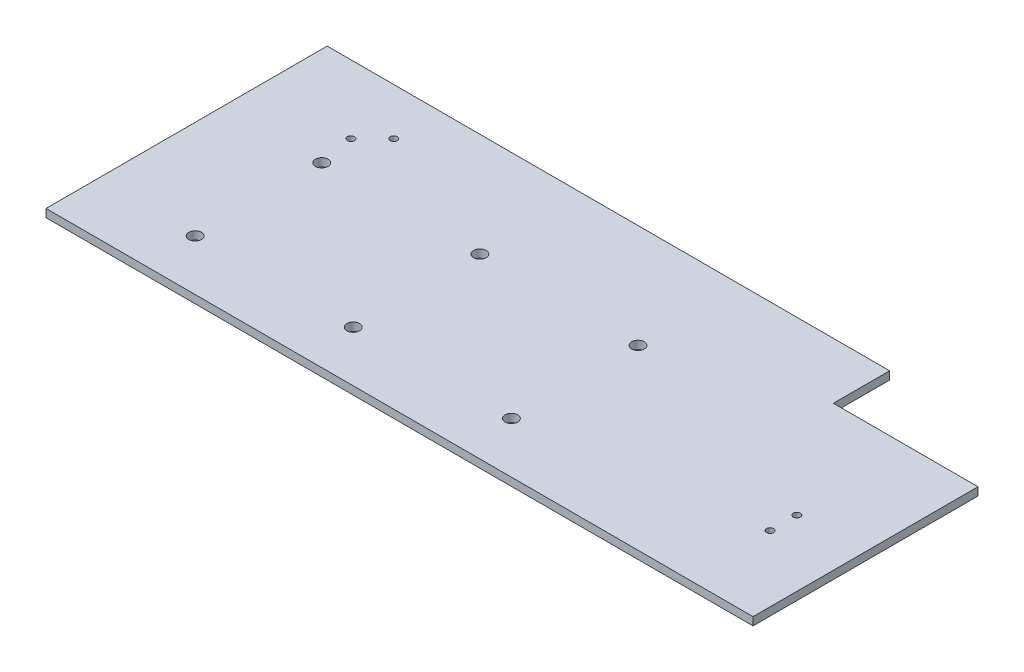
ISO-10303-21;
HEADER;
FILE_DESCRIPTION(('STEP AP214'),'2;1');
FILE_NAME('part.step','',(''),(''),'','','');
FILE_SCHEMA(('AUTOMOTIVE_DESIGN { 1 0 10303 214 1 1 1 1 }'));
ENDSEC;
DATA;
#1=APPLICATION_CONTEXT('core data for automotive mechanical design processes');
#2=APPLICATION_PROTOCOL_DEFINITION('international standard','automotive_design',2000,#1);
#3=PRODUCT_CONTEXT('',#1,'mechanical');
#4=PRODUCT('Part','Part','',(#3));
#5=PRODUCT_RELATED_PRODUCT_CATEGORY('part','',(#4));
#6=PRODUCT_DEFINITION_FORMATION('','',#4);
#7=PRODUCT_DEFINITION_CONTEXT('part definition',#1,'design');
#8=PRODUCT_DEFINITION('design','',#6,#7);
#9=PRODUCT_DEFINITION_SHAPE('','',#8);
#10=(LENGTH_UNIT() NAMED_UNIT(*) SI_UNIT(.MILLI.,.METRE.));
#11=(NAMED_UNIT(*) PLANE_ANGLE_UNIT() SI_UNIT($,.RADIAN.));
#12=(NAMED_UNIT(*) SI_UNIT($,.STERADIAN.) SOLID_ANGLE_UNIT());
#13=UNCERTAINTY_MEASURE_WITH_UNIT(LENGTH_MEASURE(1.E-05),#10,'distance_accuracy_value','');
#14=(GEOMETRIC_REPRESENTATION_CONTEXT(3) GLOBAL_UNCERTAINTY_ASSIGNED_CONTEXT((#13)) GLOBAL_UNIT_ASSIGNED_CONTEXT((#10,
#11,#12)) REPRESENTATION_CONTEXT('',''));
#15=CARTESIAN_POINT('',(0.,0.,0.));
#16=DIRECTION('',(0.,0.,1.));
#17=DIRECTION('',(1.,0.,0.));
#18=AXIS2_PLACEMENT_3D('',#15,#16,#17);
#19=CARTESIAN_POINT('',(-558.8,6.35,0.));
#20=DIRECTION('',(0.,0.,-1.));
#21=DIRECTION('',(-1.,0.,0.));
#22=AXIS2_PLACEMENT_3D('',#19,#20,#21);
#23=PLANE('',#22);
#24=DIRECTION('',(1.,0.,0.));
#25=VECTOR('',#24,1.);
#26=CARTESIAN_POINT('',(-558.8,0.,0.));
#27=LINE('',#26,#25);
#28=CARTESIAN_POINT('',(-558.8,0.,0.));
#29=VERTEX_POINT('',#28);
#30=CARTESIAN_POINT('',(0.,0.,0.));
#31=VERTEX_POINT('',#30);
#32=EDGE_CURVE('E122',#29,#31,#27,.T.);
#33=ORIENTED_EDGE('',*,*,#32,.T.);
#34=DIRECTION('',(0.,-1.,0.));
#35=VECTOR('',#34,1.);
#36=CARTESIAN_POINT('',(0.,6.35,0.));
#37=LINE('',#36,#35);
#38=CARTESIAN_POINT('',(0.,6.35,0.));
#39=VERTEX_POINT('',#38);
#40=EDGE_CURVE('E11',#39,#31,#37,.T.);
#41=ORIENTED_EDGE('',*,*,#40,.F.);
#42=DIRECTION('',(1.,0.,0.));
#43=VECTOR('',#42,1.);
#44=CARTESIAN_POINT('',(-558.8,6.35,0.));
#45=LINE('',#44,#43);
#46=CARTESIAN_POINT('',(-558.8,6.35,0.));
#47=VERTEX_POINT('',#46);
#48=EDGE_CURVE('E133',#47,#39,#45,.T.);
#49=ORIENTED_EDGE('',*,*,#48,.F.);
#50=DIRECTION('',(0.,-1.,0.));
#51=VECTOR('',#50,1.);
#52=CARTESIAN_POINT('',(-558.8,6.35,0.));
#53=LINE('',#52,#51);
#54=EDGE_CURVE('E118',#47,#29,#53,.T.);
#55=ORIENTED_EDGE('',*,*,#54,.T.);
#56=EDGE_LOOP('',(#33,#41,#49,#55));
#57=FACE_BOUND('',#56,.T.);
#58=ADVANCED_FACE('F38',(#57),#23,.F.);
#59=CARTESIAN_POINT('',(0.,6.35,0.));
#60=DIRECTION('',(-1.,0.,0.));
#61=DIRECTION('',(0.,0.,1.));
#62=AXIS2_PLACEMENT_3D('',#59,#60,#61);
#63=PLANE('',#62);
#64=DIRECTION('',(0.,0.,-1.));
#65=VECTOR('',#64,1.);
#66=CARTESIAN_POINT('',(0.,0.,0.));
#67=LINE('',#66,#65);
#68=CARTESIAN_POINT('',(0.,0.,-177.8));
#69=VERTEX_POINT('',#68);
#70=EDGE_CURVE('E125',#31,#69,#67,.T.);
#71=ORIENTED_EDGE('',*,*,#70,.T.);
#72=DIRECTION('',(0.,-1.,0.));
#73=VECTOR('',#72,1.);
#74=CARTESIAN_POINT('',(0.,6.35,-177.8));
#75=LINE('',#74,#73);
#76=CARTESIAN_POINT('',(0.,6.35,-177.8));
#77=VERTEX_POINT('',#76);
#78=EDGE_CURVE('E46',#77,#69,#75,.T.);
#79=ORIENTED_EDGE('',*,*,#78,.F.);
#80=DIRECTION('',(0.,0.,-1.));
#81=VECTOR('',#80,1.);
#82=CARTESIAN_POINT('',(0.,6.35,0.));
#83=LINE('',#82,#81);
#84=EDGE_CURVE('E91',#39,#77,#83,.T.);
#85=ORIENTED_EDGE('',*,*,#84,.F.);
#86=ORIENTED_EDGE('',*,*,#40,.T.);
#87=EDGE_LOOP('',(#71,#79,#85,#86));
#88=FACE_BOUND('',#87,.T.);
#89=ADVANCED_FACE('F158',(#88),#63,.F.);
#90=CARTESIAN_POINT('',(0.,6.35,-177.8));
#91=DIRECTION('',(0.,0.,1.));
#92=DIRECTION('',(1.,0.,0.));
#93=AXIS2_PLACEMENT_3D('',#90,#91,#92);
#94=PLANE('',#93);
#95=DIRECTION('',(-1.,0.,0.));
#96=VECTOR('',#95,1.);
#97=CARTESIAN_POINT('',(0.,0.,-177.8));
#98=LINE('',#97,#96);
#99=CARTESIAN_POINT('',(-114.3,0.,-177.8));
#100=VERTEX_POINT('',#99);
#101=EDGE_CURVE('E128',#69,#100,#98,.T.);
#102=ORIENTED_EDGE('',*,*,#101,.T.);
#103=DIRECTION('',(0.,-1.,0.));
#104=VECTOR('',#103,1.);
#105=CARTESIAN_POINT('',(-114.3,6.35,-177.8));
#106=LINE('',#105,#104);
#107=CARTESIAN_POINT('',(-114.3,6.35,-177.8));
#108=VERTEX_POINT('',#107);
#109=EDGE_CURVE('E113',#108,#100,#106,.T.);
#110=ORIENTED_EDGE('',*,*,#109,.F.);
#111=DIRECTION('',(-1.,0.,0.));
#112=VECTOR('',#111,1.);
#113=CARTESIAN_POINT('',(0.,6.35,-177.8));
#114=LINE('',#113,#112);
#115=EDGE_CURVE('E104',#77,#108,#114,.T.);
#116=ORIENTED_EDGE('',*,*,#115,.F.);
#117=ORIENTED_EDGE('',*,*,#78,.T.);
#118=EDGE_LOOP('',(#102,#110,#116,#117));
#119=FACE_BOUND('',#118,.T.);
#120=ADVANCED_FACE('F139',(#119),#94,.F.);
#121=CARTESIAN_POINT('',(-114.3,6.35,-177.8));
#122=DIRECTION('',(-1.,0.,0.));
#123=DIRECTION('',(0.,0.,1.));
#124=AXIS2_PLACEMENT_3D('',#121,#122,#123);
#125=PLANE('',#124);
#126=DIRECTION('',(0.,0.,-1.));
#127=VECTOR('',#126,1.);
#128=CARTESIAN_POINT('',(-114.3,0.,-177.8));
#129=LINE('',#128,#127);
#130=CARTESIAN_POINT('',(-114.3,0.,-222.25));
#131=VERTEX_POINT('',#130);
#132=EDGE_CURVE('E112',#100,#131,#129,.T.);
#133=ORIENTED_EDGE('',*,*,#132,.T.);
#134=DIRECTION('',(0.,-1.,0.));
#135=VECTOR('',#134,1.);
#136=CARTESIAN_POINT('',(-114.3,6.35,-222.25));
#137=LINE('',#136,#135);
#138=CARTESIAN_POINT('',(-114.3,6.35,-222.25));
#139=VERTEX_POINT('',#138);
#140=EDGE_CURVE('E109',#139,#131,#137,.T.);
#141=ORIENTED_EDGE('',*,*,#140,.F.);
#142=DIRECTION('',(0.,0.,-1.));
#143=VECTOR('',#142,1.);
#144=CARTESIAN_POINT('',(-114.3,6.35,-177.8));
#145=LINE('',#144,#143);
#146=EDGE_CURVE('E98',#108,#139,#145,.T.);
#147=ORIENTED_EDGE('',*,*,#146,.F.);
#148=ORIENTED_EDGE('',*,*,#109,.T.);
#149=EDGE_LOOP('',(#133,#141,#147,#148));
#150=FACE_BOUND('',#149,.T.);
#151=ADVANCED_FACE('F110',(#150),#125,.F.);
#152=CARTESIAN_POINT('',(-114.3,6.35,-222.25));
#153=DIRECTION('',(0.,0.,1.));
#154=DIRECTION('',(1.,0.,0.));
#155=AXIS2_PLACEMENT_3D('',#152,#153,#154);
#156=PLANE('',#155);
#157=DIRECTION('',(-1.,0.,0.));
#158=VECTOR('',#157,1.);
#159=CARTESIAN_POINT('',(-114.3,0.,-222.25));
#160=LINE('',#159,#158);
#161=CARTESIAN_POINT('',(-558.8,0.,-222.25));
#162=VERTEX_POINT('',#161);
#163=EDGE_CURVE('E77',#131,#162,#160,.T.);
#164=ORIENTED_EDGE('',*,*,#163,.T.);
#165=DIRECTION('',(0.,-1.,0.));
#166=VECTOR('',#165,1.);
#167=CARTESIAN_POINT('',(-558.8,6.35,-222.25));
#168=LINE('',#167,#166);
#169=CARTESIAN_POINT('',(-558.8,6.35,-222.25));
#170=VERTEX_POINT('',#169);
#171=EDGE_CURVE('E114',#170,#162,#168,.T.);
#172=ORIENTED_EDGE('',*,*,#171,.F.);
#173=DIRECTION('',(-1.,0.,0.));
#174=VECTOR('',#173,1.);
#175=CARTESIAN_POINT('',(-114.3,6.35,-222.25));
#176=LINE('',#175,#174);
#177=EDGE_CURVE('E102',#139,#170,#176,.T.);
#178=ORIENTED_EDGE('',*,*,#177,.F.);
#179=ORIENTED_EDGE('',*,*,#140,.T.);
#180=EDGE_LOOP('',(#164,#172,#178,#179));
#181=FACE_BOUND('',#180,.T.);
#182=ADVANCED_FACE('F116',(#181),#156,.F.);
#183=CARTESIAN_POINT('',(-558.8,6.35,-222.25));
#184=DIRECTION('',(1.,0.,0.));
#185=DIRECTION('',(0.,0.,-1.));
#186=AXIS2_PLACEMENT_3D('',#183,#184,#185);
#187=PLANE('',#186);
#188=DIRECTION('',(0.,0.,1.));
#189=VECTOR('',#188,1.);
#190=CARTESIAN_POINT('',(-558.8,0.,-222.25));
#191=LINE('',#190,#189);
#192=EDGE_CURVE('E83',#162,#29,#191,.T.);
#193=ORIENTED_EDGE('',*,*,#192,.T.);
#194=ORIENTED_EDGE('',*,*,#54,.F.);
#195=DIRECTION('',(0.,0.,1.));
#196=VECTOR('',#195,1.);
#197=CARTESIAN_POINT('',(-558.8,6.35,-222.25));
#198=LINE('',#197,#196);
#199=EDGE_CURVE('E54',#170,#47,#198,.T.);
#200=ORIENTED_EDGE('',*,*,#199,.F.);
#201=ORIENTED_EDGE('',*,*,#171,.T.);
#202=EDGE_LOOP('',(#193,#194,#200,#201));
#203=FACE_BOUND('',#202,.T.);
#204=ADVANCED_FACE('F146',(#203),#187,.F.);
#205=CARTESIAN_POINT('',(0.,6.35,0.));
#206=DIRECTION('',(0.,1.,0.));
#207=DIRECTION('',(0.,0.,1.));
#208=AXIS2_PLACEMENT_3D('',#205,#206,#207);
#209=PLANE('',#208);
#210=CARTESIAN_POINT('',(-486.075566666667,6.35,-168.253833333333));
#211=DIRECTION('',(0.,-1.,0.));
#212=DIRECTION('',(0.,0.,-1.));
#213=AXIS2_PLACEMENT_3D('',#210,#211,#212);
#214=CIRCLE('',#213,2.77812500000002);
#215=CARTESIAN_POINT('',(-486.075566666667,6.35,-171.031958333333));
#216=VERTEX_POINT('',#215);
#217=EDGE_CURVE('E301',#216,#216,#214,.T.);
#218=ORIENTED_EDGE('',*,*,#217,.T.);
#219=EDGE_LOOP('',(#218));
#220=FACE_BOUND('',#219,.T.);
#221=CARTESIAN_POINT('',(-469.142233333333,6.35,-185.187166666667));
#222=DIRECTION('',(0.,-1.,0.));
#223=DIRECTION('',(0.,0.,-1.));
#224=AXIS2_PLACEMENT_3D('',#221,#222,#223);
#225=CIRCLE('',#224,2.77812500000002);
#226=CARTESIAN_POINT('',(-469.142233333333,6.35,-187.965291666667));
#227=VERTEX_POINT('',#226);
#228=EDGE_CURVE('E391',#227,#227,#225,.T.);
#229=ORIENTED_EDGE('',*,*,#228,.T.);
#230=EDGE_LOOP('',(#229));
#231=FACE_BOUND('',#230,.T.);
#232=CARTESIAN_POINT('',(-52.1589,6.35,-65.6166666666667));
#233=DIRECTION('',(0.,-1.,0.));
#234=DIRECTION('',(0.,0.,-1.));
#235=AXIS2_PLACEMENT_3D('',#232,#233,#234);
#236=CIRCLE('',#235,2.778125);
#237=CARTESIAN_POINT('',(-52.1589,6.35,-68.3947916666667));
#238=VERTEX_POINT('',#237);
#239=EDGE_CURVE('E317',#238,#238,#236,.T.);
#240=ORIENTED_EDGE('',*,*,#239,.T.);
#241=EDGE_LOOP('',(#240));
#242=FACE_BOUND('',#241,.T.);
#243=CARTESIAN_POINT('',(-52.1589,6.35,-86.7833333333333));
#244=DIRECTION('',(0.,-1.,0.));
#245=DIRECTION('',(0.,0.,-1.));
#246=AXIS2_PLACEMENT_3D('',#243,#244,#245);
#247=CIRCLE('',#246,2.778125);
#248=CARTESIAN_POINT('',(-52.1589,6.35,-89.5614583333334));
#249=VERTEX_POINT('',#248);
#250=EDGE_CURVE('E310',#249,#249,#247,.T.);
#251=ORIENTED_EDGE('',*,*,#250,.T.);
#252=EDGE_LOOP('',(#251));
#253=FACE_BOUND('',#252,.T.);
#254=CARTESIAN_POINT('',(-481.076,6.35,-140.208));
#255=DIRECTION('',(0.,1.,0.));
#256=DIRECTION('',(0.,0.,1.));
#257=AXIS2_PLACEMENT_3D('',#254,#255,#256);
#258=CIRCLE('',#257,5.00000270000002);
#259=CARTESIAN_POINT('',(-481.076,6.35,-135.2079973));
#260=VERTEX_POINT('',#259);
#261=EDGE_CURVE('E126',#260,#260,#258,.T.);
#262=ORIENTED_EDGE('',*,*,#261,.F.);
#263=EDGE_LOOP('',(#262));
#264=FACE_BOUND('',#263,.T.);
#265=CARTESIAN_POINT('',(-231.14,6.35,-140.208));
#266=DIRECTION('',(0.,1.,0.));
#267=DIRECTION('',(0.,0.,1.));
#268=AXIS2_PLACEMENT_3D('',#265,#266,#267);
#269=CIRCLE('',#268,5.00000270000002);
#270=CARTESIAN_POINT('',(-231.14,6.35,-135.2079973));
#271=VERTEX_POINT('',#270);
#272=EDGE_CURVE('E347',#271,#271,#269,.T.);
#273=ORIENTED_EDGE('',*,*,#272,.F.);
#274=EDGE_LOOP('',(#273));
#275=FACE_BOUND('',#274,.T.);
#276=CARTESIAN_POINT('',(-356.108,6.35,-140.208));
#277=DIRECTION('',(0.,1.,0.));
#278=DIRECTION('',(0.,0.,1.));
#279=AXIS2_PLACEMENT_3D('',#276,#277,#278);
#280=CIRCLE('',#279,5.00000270000002);
#281=CARTESIAN_POINT('',(-356.108,6.35,-135.2079973));
#282=VERTEX_POINT('',#281);
#283=EDGE_CURVE('E344',#282,#282,#280,.T.);
#284=ORIENTED_EDGE('',*,*,#283,.F.);
#285=EDGE_LOOP('',(#284));
#286=FACE_BOUND('',#285,.T.);
#287=CARTESIAN_POINT('',(-231.14,6.35,-40.132));
#288=DIRECTION('',(0.,1.,0.));
#289=DIRECTION('',(0.,0.,1.));
#290=AXIS2_PLACEMENT_3D('',#287,#288,#289);
#291=CIRCLE('',#290,5.00000270000002);
#292=CARTESIAN_POINT('',(-231.14,6.35,-35.1319973));
#293=VERTEX_POINT('',#292);
#294=EDGE_CURVE('E341',#293,#293,#291,.T.);
#295=ORIENTED_EDGE('',*,*,#294,.F.);
#296=EDGE_LOOP('',(#295));
#297=FACE_BOUND('',#296,.T.);
#298=CARTESIAN_POINT('',(-356.108,6.35,-40.132));
#299=DIRECTION('',(0.,1.,0.));
#300=DIRECTION('',(0.,0.,1.));
#301=AXIS2_PLACEMENT_3D('',#298,#299,#300);
#302=CIRCLE('',#301,5.00000270000002);
#303=CARTESIAN_POINT('',(-356.108,6.35,-35.1319973));
#304=VERTEX_POINT('',#303);
#305=EDGE_CURVE('E338',#304,#304,#302,.T.);
#306=ORIENTED_EDGE('',*,*,#305,.F.);
#307=EDGE_LOOP('',(#306));
#308=FACE_BOUND('',#307,.T.);
#309=CARTESIAN_POINT('',(-481.076,6.35,-40.132));
#310=DIRECTION('',(0.,1.,0.));
#311=DIRECTION('',(0.,0.,1.));
#312=AXIS2_PLACEMENT_3D('',#309,#310,#311);
#313=CIRCLE('',#312,5.00000270000002);
#314=CARTESIAN_POINT('',(-481.076,6.35,-35.1319973));
#315=VERTEX_POINT('',#314);
#316=EDGE_CURVE('E335',#315,#315,#313,.T.);
#317=ORIENTED_EDGE('',*,*,#316,.F.);
#318=EDGE_LOOP('',(#317));
#319=FACE_BOUND('',#318,.T.);
#320=ORIENTED_EDGE('',*,*,#48,.T.);
#321=ORIENTED_EDGE('',*,*,#84,.T.);
#322=ORIENTED_EDGE('',*,*,#115,.T.);
#323=ORIENTED_EDGE('',*,*,#146,.T.);
#324=ORIENTED_EDGE('',*,*,#177,.T.);
#325=ORIENTED_EDGE('',*,*,#199,.T.);
#326=EDGE_LOOP('',(#320,#321,#322,#323,#324,#325));
#327=FACE_BOUND('',#326,.T.);
#328=ADVANCED_FACE('F100',(#220,#231,#242,#253,#264,#275,#286,#297,#308,#319,#327),#209,.T.);
#329=CARTESIAN_POINT('',(0.,0.,0.));
#330=DIRECTION('',(0.,1.,0.));
#331=DIRECTION('',(0.,0.,1.));
#332=AXIS2_PLACEMENT_3D('',#329,#330,#331);
#333=PLANE('',#332);
#334=CARTESIAN_POINT('',(-486.075566666667,0.,-168.253833333333));
#335=DIRECTION('',(0.,-1.,0.));
#336=DIRECTION('',(0.,0.,-1.));
#337=AXIS2_PLACEMENT_3D('',#334,#335,#336);
#338=CIRCLE('',#337,2.77812500000002);
#339=CARTESIAN_POINT('',(-486.075566666667,0.,-171.031958333333));
#340=VERTEX_POINT('',#339);
#341=EDGE_CURVE('E304',#340,#340,#338,.T.);
#342=ORIENTED_EDGE('',*,*,#341,.F.);
#343=EDGE_LOOP('',(#342));
#344=FACE_BOUND('',#343,.T.);
#345=CARTESIAN_POINT('',(-469.142233333333,0.,-185.187166666667));
#346=DIRECTION('',(0.,-1.,0.));
#347=DIRECTION('',(0.,0.,-1.));
#348=AXIS2_PLACEMENT_3D('',#345,#346,#347);
#349=CIRCLE('',#348,2.77812500000002);
#350=CARTESIAN_POINT('',(-469.142233333333,0.,-187.965291666667));
#351=VERTEX_POINT('',#350);
#352=EDGE_CURVE('E306',#351,#351,#349,.T.);
#353=ORIENTED_EDGE('',*,*,#352,.F.);
#354=EDGE_LOOP('',(#353));
#355=FACE_BOUND('',#354,.T.);
#356=CARTESIAN_POINT('',(-52.1589,0.,-65.6166666666667));
#357=DIRECTION('',(0.,-1.,0.));
#358=DIRECTION('',(0.,0.,-1.));
#359=AXIS2_PLACEMENT_3D('',#356,#357,#358);
#360=CIRCLE('',#359,2.778125);
#361=CARTESIAN_POINT('',(-52.1589,0.,-68.3947916666667));
#362=VERTEX_POINT('',#361);
#363=EDGE_CURVE('E386',#362,#362,#360,.T.);
#364=ORIENTED_EDGE('',*,*,#363,.F.);
#365=EDGE_LOOP('',(#364));
#366=FACE_BOUND('',#365,.T.);
#367=CARTESIAN_POINT('',(-52.1589,0.,-86.7833333333333));
#368=DIRECTION('',(0.,-1.,0.));
#369=DIRECTION('',(0.,0.,-1.));
#370=AXIS2_PLACEMENT_3D('',#367,#368,#369);
#371=CIRCLE('',#370,2.778125);
#372=CARTESIAN_POINT('',(-52.1589,0.,-89.5614583333334));
#373=VERTEX_POINT('',#372);
#374=EDGE_CURVE('E314',#373,#373,#371,.T.);
#375=ORIENTED_EDGE('',*,*,#374,.F.);
#376=EDGE_LOOP('',(#375));
#377=FACE_BOUND('',#376,.T.);
#378=CARTESIAN_POINT('',(-481.076,0.,-140.208));
#379=DIRECTION('',(0.,1.,0.));
#380=DIRECTION('',(0.,0.,1.));
#381=AXIS2_PLACEMENT_3D('',#378,#379,#380);
#382=CIRCLE('',#381,5.00000270000002);
#383=CARTESIAN_POINT('',(-481.076,0.,-135.2079973));
#384=VERTEX_POINT('',#383);
#385=EDGE_CURVE('E313',#384,#384,#382,.T.);
#386=ORIENTED_EDGE('',*,*,#385,.T.);
#387=EDGE_LOOP('',(#386));
#388=FACE_BOUND('',#387,.T.);
#389=CARTESIAN_POINT('',(-231.14,0.,-140.208));
#390=DIRECTION('',(0.,1.,0.));
#391=DIRECTION('',(0.,0.,1.));
#392=AXIS2_PLACEMENT_3D('',#389,#390,#391);
#393=CIRCLE('',#392,5.00000270000002);
#394=CARTESIAN_POINT('',(-231.14,0.,-135.2079973));
#395=VERTEX_POINT('',#394);
#396=EDGE_CURVE('E328',#395,#395,#393,.T.);
#397=ORIENTED_EDGE('',*,*,#396,.T.);
#398=EDGE_LOOP('',(#397));
#399=FACE_BOUND('',#398,.T.);
#400=CARTESIAN_POINT('',(-356.108,0.,-140.208));
#401=DIRECTION('',(0.,1.,0.));
#402=DIRECTION('',(0.,0.,1.));
#403=AXIS2_PLACEMENT_3D('',#400,#401,#402);
#404=CIRCLE('',#403,5.00000270000002);
#405=CARTESIAN_POINT('',(-356.108,0.,-135.2079973));
#406=VERTEX_POINT('',#405);
#407=EDGE_CURVE('E325',#406,#406,#404,.T.);
#408=ORIENTED_EDGE('',*,*,#407,.T.);
#409=EDGE_LOOP('',(#408));
#410=FACE_BOUND('',#409,.T.);
#411=CARTESIAN_POINT('',(-231.14,0.,-40.132));
#412=DIRECTION('',(0.,1.,0.));
#413=DIRECTION('',(0.,0.,1.));
#414=AXIS2_PLACEMENT_3D('',#411,#412,#413);
#415=CIRCLE('',#414,5.00000270000002);
#416=CARTESIAN_POINT('',(-231.14,0.,-35.1319973));
#417=VERTEX_POINT('',#416);
#418=EDGE_CURVE('E322',#417,#417,#415,.T.);
#419=ORIENTED_EDGE('',*,*,#418,.T.);
#420=EDGE_LOOP('',(#419));
#421=FACE_BOUND('',#420,.T.);
#422=CARTESIAN_POINT('',(-356.108,0.,-40.132));
#423=DIRECTION('',(0.,1.,0.));
#424=DIRECTION('',(0.,0.,1.));
#425=AXIS2_PLACEMENT_3D('',#422,#423,#424);
#426=CIRCLE('',#425,5.00000270000002);
#427=CARTESIAN_POINT('',(-356.108,0.,-35.1319973));
#428=VERTEX_POINT('',#427);
#429=EDGE_CURVE('E318',#428,#428,#426,.T.);
#430=ORIENTED_EDGE('',*,*,#429,.T.);
#431=EDGE_LOOP('',(#430));
#432=FACE_BOUND('',#431,.T.);
#433=CARTESIAN_POINT('',(-481.076,0.,-40.132));
#434=DIRECTION('',(0.,1.,0.));
#435=DIRECTION('',(0.,0.,1.));
#436=AXIS2_PLACEMENT_3D('',#433,#434,#435);
#437=CIRCLE('',#436,5.00000270000002);
#438=CARTESIAN_POINT('',(-481.076,0.,-35.1319973));
#439=VERTEX_POINT('',#438);
#440=EDGE_CURVE('E321',#439,#439,#437,.T.);
#441=ORIENTED_EDGE('',*,*,#440,.T.);
#442=EDGE_LOOP('',(#441));
#443=FACE_BOUND('',#442,.T.);
#444=ORIENTED_EDGE('',*,*,#32,.F.);
#445=ORIENTED_EDGE('',*,*,#192,.F.);
#446=ORIENTED_EDGE('',*,*,#163,.F.);
#447=ORIENTED_EDGE('',*,*,#132,.F.);
#448=ORIENTED_EDGE('',*,*,#101,.F.);
#449=ORIENTED_EDGE('',*,*,#70,.F.);
#450=EDGE_LOOP('',(#444,#445,#446,#447,#448,#449));
#451=FACE_BOUND('',#450,.T.);
#452=ADVANCED_FACE('F142',(#344,#355,#366,#377,#388,#399,#410,#421,#432,#443,#451),#333,.F.);
#453=CARTESIAN_POINT('',(-481.076,0.,-40.132));
#454=DIRECTION('',(0.,1.,0.));
#455=DIRECTION('',(0.,0.,1.));
#456=AXIS2_PLACEMENT_3D('',#453,#454,#455);
#457=CYLINDRICAL_SURFACE('',#456,5.00000270000002);
#458=ORIENTED_EDGE('',*,*,#316,.T.);
#459=EDGE_LOOP('',(#458));
#460=FACE_BOUND('',#459,.T.);
#461=ORIENTED_EDGE('',*,*,#440,.F.);
#462=EDGE_LOOP('',(#461));
#463=FACE_BOUND('',#462,.T.);
#464=ADVANCED_FACE('F186',(#460,#463),#457,.F.);
#465=CARTESIAN_POINT('',(-356.108,0.,-40.132));
#466=DIRECTION('',(0.,1.,0.));
#467=DIRECTION('',(0.,0.,1.));
#468=AXIS2_PLACEMENT_3D('',#465,#466,#467);
#469=CYLINDRICAL_SURFACE('',#468,5.00000270000002);
#470=ORIENTED_EDGE('',*,*,#305,.T.);
#471=EDGE_LOOP('',(#470));
#472=FACE_BOUND('',#471,.T.);
#473=ORIENTED_EDGE('',*,*,#429,.F.);
#474=EDGE_LOOP('',(#473));
#475=FACE_BOUND('',#474,.T.);
#476=ADVANCED_FACE('F191',(#472,#475),#469,.F.);
#477=CARTESIAN_POINT('',(-231.14,0.,-40.132));
#478=DIRECTION('',(0.,1.,0.));
#479=DIRECTION('',(0.,0.,1.));
#480=AXIS2_PLACEMENT_3D('',#477,#478,#479);
#481=CYLINDRICAL_SURFACE('',#480,5.00000270000002);
#482=ORIENTED_EDGE('',*,*,#294,.T.);
#483=EDGE_LOOP('',(#482));
#484=FACE_BOUND('',#483,.T.);
#485=ORIENTED_EDGE('',*,*,#418,.F.);
#486=EDGE_LOOP('',(#485));
#487=FACE_BOUND('',#486,.T.);
#488=ADVANCED_FACE('F203',(#484,#487),#481,.F.);
#489=CARTESIAN_POINT('',(-356.108,0.,-140.208));
#490=DIRECTION('',(0.,1.,0.));
#491=DIRECTION('',(0.,0.,1.));
#492=AXIS2_PLACEMENT_3D('',#489,#490,#491);
#493=CYLINDRICAL_SURFACE('',#492,5.00000270000002);
#494=ORIENTED_EDGE('',*,*,#283,.T.);
#495=EDGE_LOOP('',(#494));
#496=FACE_BOUND('',#495,.T.);
#497=ORIENTED_EDGE('',*,*,#407,.F.);
#498=EDGE_LOOP('',(#497));
#499=FACE_BOUND('',#498,.T.);
#500=ADVANCED_FACE('F213',(#496,#499),#493,.F.);
#501=CARTESIAN_POINT('',(-231.14,0.,-140.208));
#502=DIRECTION('',(0.,1.,0.));
#503=DIRECTION('',(0.,0.,1.));
#504=AXIS2_PLACEMENT_3D('',#501,#502,#503);
#505=CYLINDRICAL_SURFACE('',#504,5.00000270000002);
#506=ORIENTED_EDGE('',*,*,#272,.T.);
#507=EDGE_LOOP('',(#506));
#508=FACE_BOUND('',#507,.T.);
#509=ORIENTED_EDGE('',*,*,#396,.F.);
#510=EDGE_LOOP('',(#509));
#511=FACE_BOUND('',#510,.T.);
#512=ADVANCED_FACE('F223',(#508,#511),#505,.F.);
#513=CARTESIAN_POINT('',(-481.076,0.,-140.208));
#514=DIRECTION('',(0.,1.,0.));
#515=DIRECTION('',(0.,0.,1.));
#516=AXIS2_PLACEMENT_3D('',#513,#514,#515);
#517=CYLINDRICAL_SURFACE('',#516,5.00000270000002);
#518=ORIENTED_EDGE('',*,*,#261,.T.);
#519=EDGE_LOOP('',(#518));
#520=FACE_BOUND('',#519,.T.);
#521=ORIENTED_EDGE('',*,*,#385,.F.);
#522=EDGE_LOOP('',(#521));
#523=FACE_BOUND('',#522,.T.);
#524=ADVANCED_FACE('F233',(#520,#523),#517,.F.);
#525=CARTESIAN_POINT('',(-52.1589,6.35,-86.7833333333333));
#526=DIRECTION('',(0.,-1.,0.));
#527=DIRECTION('',(0.,0.,-1.));
#528=AXIS2_PLACEMENT_3D('',#525,#526,#527);
#529=CYLINDRICAL_SURFACE('',#528,2.778125);
#530=ORIENTED_EDGE('',*,*,#250,.F.);
#531=EDGE_LOOP('',(#530));
#532=FACE_BOUND('',#531,.T.);
#533=ORIENTED_EDGE('',*,*,#374,.T.);
#534=EDGE_LOOP('',(#533));
#535=FACE_BOUND('',#534,.T.);
#536=ADVANCED_FACE('F243',(#532,#535),#529,.F.);
#537=CARTESIAN_POINT('',(-52.1589,6.35,-65.6166666666667));
#538=DIRECTION('',(0.,-1.,0.));
#539=DIRECTION('',(0.,0.,-1.));
#540=AXIS2_PLACEMENT_3D('',#537,#538,#539);
#541=CYLINDRICAL_SURFACE('',#540,2.778125);
#542=ORIENTED_EDGE('',*,*,#239,.F.);
#543=EDGE_LOOP('',(#542));
#544=FACE_BOUND('',#543,.T.);
#545=ORIENTED_EDGE('',*,*,#363,.T.);
#546=EDGE_LOOP('',(#545));
#547=FACE_BOUND('',#546,.T.);
#548=ADVANCED_FACE('F264',(#544,#547),#541,.F.);
#549=CARTESIAN_POINT('',(-469.142233333333,6.35,-185.187166666667));
#550=DIRECTION('',(0.,-1.,0.));
#551=DIRECTION('',(0.,0.,-1.));
#552=AXIS2_PLACEMENT_3D('',#549,#550,#551);
#553=CYLINDRICAL_SURFACE('',#552,2.77812500000002);
#554=ORIENTED_EDGE('',*,*,#228,.F.);
#555=EDGE_LOOP('',(#554));
#556=FACE_BOUND('',#555,.T.);
#557=ORIENTED_EDGE('',*,*,#352,.T.);
#558=EDGE_LOOP('',(#557));
#559=FACE_BOUND('',#558,.T.);
#560=ADVANCED_FACE('F274',(#556,#559),#553,.F.);
#561=CARTESIAN_POINT('',(-486.075566666667,6.35,-168.253833333333));
#562=DIRECTION('',(0.,-1.,0.));
#563=DIRECTION('',(0.,0.,-1.));
#564=AXIS2_PLACEMENT_3D('',#561,#562,#563);
#565=CYLINDRICAL_SURFACE('',#564,2.77812500000002);
#566=ORIENTED_EDGE('',*,*,#217,.F.);
#567=EDGE_LOOP('',(#566));
#568=FACE_BOUND('',#567,.T.);
#569=ORIENTED_EDGE('',*,*,#341,.T.);
#570=EDGE_LOOP('',(#569));
#571=FACE_BOUND('',#570,.T.);
#572=ADVANCED_FACE('F284',(#568,#571),#565,.F.);
#573=CLOSED_SHELL('',(#58,#89,#120,#151,#182,#204,#328,#452,#464,#476,#488,#500,#512,#524,#536,
#548,#560,#572));
#574=MANIFOLD_SOLID_BREP('B2',#573);
#575=ADVANCED_BREP_SHAPE_REPRESENTATION('',(#18,#574),#14);
#576=SHAPE_DEFINITION_REPRESENTATION(#9,#575);
ENDSEC;
END-ISO-10303-21;
